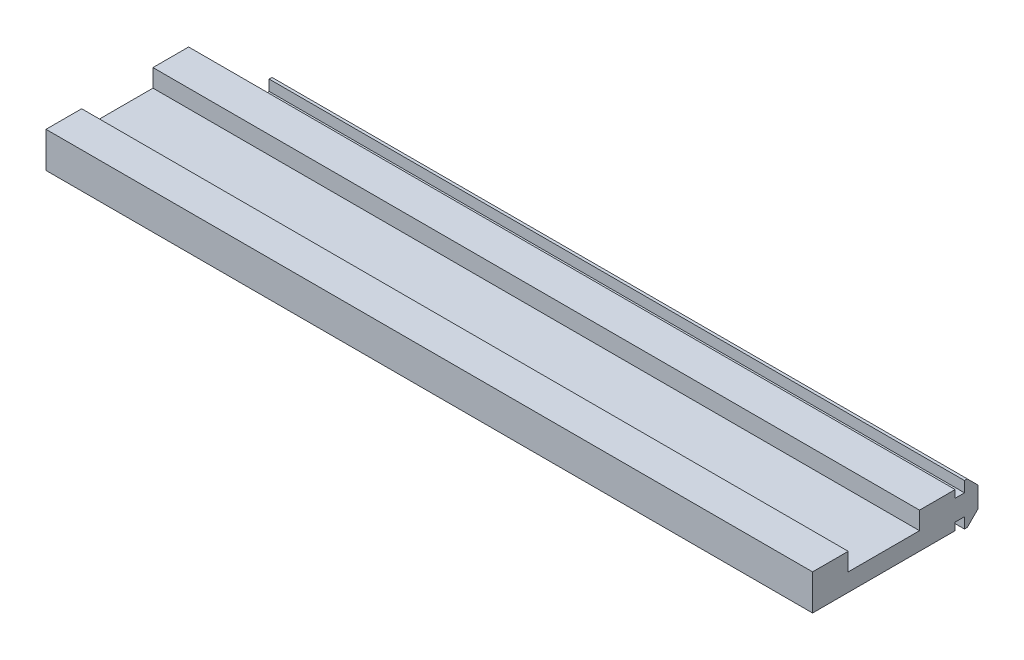
ISO-10303-21;
HEADER;
FILE_DESCRIPTION(('STEP AP214'),'2;1');
FILE_NAME('part.step','',(''),(''),'','','');
FILE_SCHEMA(('AUTOMOTIVE_DESIGN { 1 0 10303 214 1 1 1 1 }'));
ENDSEC;
DATA;
#1=APPLICATION_CONTEXT('core data for automotive mechanical design processes');
#2=APPLICATION_PROTOCOL_DEFINITION('international standard','automotive_design',2000,#1);
#3=PRODUCT_CONTEXT('',#1,'mechanical');
#4=PRODUCT('Part','Part','',(#3));
#5=PRODUCT_RELATED_PRODUCT_CATEGORY('part','',(#4));
#6=PRODUCT_DEFINITION_FORMATION('','',#4);
#7=PRODUCT_DEFINITION_CONTEXT('part definition',#1,'design');
#8=PRODUCT_DEFINITION('design','',#6,#7);
#9=PRODUCT_DEFINITION_SHAPE('','',#8);
#10=(LENGTH_UNIT() NAMED_UNIT(*) SI_UNIT(.MILLI.,.METRE.));
#11=(NAMED_UNIT(*) PLANE_ANGLE_UNIT() SI_UNIT($,.RADIAN.));
#12=(NAMED_UNIT(*) SI_UNIT($,.STERADIAN.) SOLID_ANGLE_UNIT());
#13=UNCERTAINTY_MEASURE_WITH_UNIT(LENGTH_MEASURE(1.E-05),#10,'distance_accuracy_value','');
#14=(GEOMETRIC_REPRESENTATION_CONTEXT(3) GLOBAL_UNCERTAINTY_ASSIGNED_CONTEXT((#13)) GLOBAL_UNIT_ASSIGNED_CONTEXT((#10,
#11,#12)) REPRESENTATION_CONTEXT('',''));
#15=CARTESIAN_POINT('',(0.,0.,0.));
#16=DIRECTION('',(0.,0.,1.));
#17=DIRECTION('',(1.,0.,0.));
#18=AXIS2_PLACEMENT_3D('',#15,#16,#17);
#19=CARTESIAN_POINT('',(495.,5.,0.));
#20=DIRECTION('',(0.,1.,0.));
#21=DIRECTION('',(0.,0.,1.));
#22=AXIS2_PLACEMENT_3D('',#19,#20,#21);
#23=PLANE('',#22);
#24=DIRECTION('',(-1.,0.,0.));
#25=VECTOR('',#24,1.);
#26=CARTESIAN_POINT('',(495.,5.,20.5));
#27=LINE('',#26,#25);
#28=CARTESIAN_POINT('',(280.,5.,20.5));
#29=VERTEX_POINT('',#28);
#30=CARTESIAN_POINT('',(65.,5.,20.5));
#31=VERTEX_POINT('',#30);
#32=EDGE_CURVE('E50',#29,#31,#27,.T.);
#33=ORIENTED_EDGE('',*,*,#32,.F.);
#34=DIRECTION('',(0.,0.,-1.));
#35=VECTOR('',#34,1.);
#36=CARTESIAN_POINT('',(280.,5.,0.));
#37=LINE('',#36,#35);
#38=CARTESIAN_POINT('',(280.,5.,10.5));
#39=VERTEX_POINT('',#38);
#40=EDGE_CURVE('E247',#29,#39,#37,.T.);
#41=ORIENTED_EDGE('',*,*,#40,.T.);
#42=DIRECTION('',(-1.,0.,0.));
#43=VECTOR('',#42,1.);
#44=CARTESIAN_POINT('',(495.,5.,10.5));
#45=LINE('',#44,#43);
#46=CARTESIAN_POINT('',(65.,5.,10.5));
#47=VERTEX_POINT('',#46);
#48=EDGE_CURVE('E11',#39,#47,#45,.T.);
#49=ORIENTED_EDGE('',*,*,#48,.T.);
#50=DIRECTION('',(0.,0.,-1.));
#51=VECTOR('',#50,1.);
#52=CARTESIAN_POINT('',(65.,5.,0.));
#53=LINE('',#52,#51);
#54=EDGE_CURVE('E251',#31,#47,#53,.T.);
#55=ORIENTED_EDGE('',*,*,#54,.F.);
#56=EDGE_LOOP('',(#33,#41,#49,#55));
#57=FACE_BOUND('',#56,.T.);
#58=ADVANCED_FACE('F43',(#57),#23,.T.);
#59=CARTESIAN_POINT('',(495.,0.,20.5));
#60=DIRECTION('',(0.,0.,1.));
#61=DIRECTION('',(1.,0.,0.));
#62=AXIS2_PLACEMENT_3D('',#59,#60,#61);
#63=PLANE('',#62);
#64=DIRECTION('',(-1.,0.,0.));
#65=VECTOR('',#64,1.);
#66=CARTESIAN_POINT('',(495.,0.,20.5));
#67=LINE('',#66,#65);
#68=CARTESIAN_POINT('',(280.,0.,20.5));
#69=VERTEX_POINT('',#68);
#70=CARTESIAN_POINT('',(65.,0.,20.5));
#71=VERTEX_POINT('',#70);
#72=EDGE_CURVE('E285',#69,#71,#67,.T.);
#73=ORIENTED_EDGE('',*,*,#72,.F.);
#74=DIRECTION('',(0.,1.,0.));
#75=VECTOR('',#74,1.);
#76=CARTESIAN_POINT('',(280.,0.,20.5));
#77=LINE('',#76,#75);
#78=EDGE_CURVE('E244',#69,#29,#77,.T.);
#79=ORIENTED_EDGE('',*,*,#78,.T.);
#80=ORIENTED_EDGE('',*,*,#32,.T.);
#81=DIRECTION('',(0.,1.,0.));
#82=VECTOR('',#81,1.);
#83=CARTESIAN_POINT('',(65.,0.,20.5));
#84=LINE('',#83,#82);
#85=EDGE_CURVE('E254',#71,#31,#84,.T.);
#86=ORIENTED_EDGE('',*,*,#85,.F.);
#87=EDGE_LOOP('',(#73,#79,#80,#86));
#88=FACE_BOUND('',#87,.T.);
#89=ADVANCED_FACE('F291',(#88),#63,.T.);
#90=CARTESIAN_POINT('',(495.,0.,0.));
#91=DIRECTION('',(0.,1.,0.));
#92=DIRECTION('',(0.,0.,1.));
#93=AXIS2_PLACEMENT_3D('',#90,#91,#92);
#94=PLANE('',#93);
#95=DIRECTION('',(-1.,0.,0.));
#96=VECTOR('',#95,1.);
#97=CARTESIAN_POINT('',(495.,0.,40.5));
#98=LINE('',#97,#96);
#99=CARTESIAN_POINT('',(280.,0.,40.5));
#100=VERTEX_POINT('',#99);
#101=CARTESIAN_POINT('',(65.,0.,40.5));
#102=VERTEX_POINT('',#101);
#103=EDGE_CURVE('E283',#100,#102,#98,.T.);
#104=ORIENTED_EDGE('',*,*,#103,.F.);
#105=DIRECTION('',(0.,0.,-1.));
#106=VECTOR('',#105,1.);
#107=CARTESIAN_POINT('',(280.,0.,0.));
#108=LINE('',#107,#106);
#109=EDGE_CURVE('E241',#100,#69,#108,.T.);
#110=ORIENTED_EDGE('',*,*,#109,.T.);
#111=ORIENTED_EDGE('',*,*,#72,.T.);
#112=DIRECTION('',(0.,0.,-1.));
#113=VECTOR('',#112,1.);
#114=CARTESIAN_POINT('',(65.,0.,0.));
#115=LINE('',#114,#113);
#116=EDGE_CURVE('E257',#102,#71,#115,.T.);
#117=ORIENTED_EDGE('',*,*,#116,.F.);
#118=EDGE_LOOP('',(#104,#110,#111,#117));
#119=FACE_BOUND('',#118,.T.);
#120=ADVANCED_FACE('F301',(#119),#94,.T.);
#121=CARTESIAN_POINT('',(495.,0.,40.5));
#122=DIRECTION('',(0.,0.,-1.));
#123=DIRECTION('',(-1.,0.,0.));
#124=AXIS2_PLACEMENT_3D('',#121,#122,#123);
#125=PLANE('',#124);
#126=DIRECTION('',(-1.,0.,0.));
#127=VECTOR('',#126,1.);
#128=CARTESIAN_POINT('',(495.,4.99999999999999,40.5));
#129=LINE('',#128,#127);
#130=CARTESIAN_POINT('',(280.,4.99999999999999,40.5));
#131=VERTEX_POINT('',#130);
#132=CARTESIAN_POINT('',(65.,4.99999999999999,40.5));
#133=VERTEX_POINT('',#132);
#134=EDGE_CURVE('E281',#131,#133,#129,.T.);
#135=ORIENTED_EDGE('',*,*,#134,.F.);
#136=DIRECTION('',(0.,-1.,0.));
#137=VECTOR('',#136,1.);
#138=CARTESIAN_POINT('',(280.,0.,40.5));
#139=LINE('',#138,#137);
#140=EDGE_CURVE('E238',#131,#100,#139,.T.);
#141=ORIENTED_EDGE('',*,*,#140,.T.);
#142=ORIENTED_EDGE('',*,*,#103,.T.);
#143=DIRECTION('',(0.,-1.,0.));
#144=VECTOR('',#143,1.);
#145=CARTESIAN_POINT('',(65.,0.,40.5));
#146=LINE('',#145,#144);
#147=EDGE_CURVE('E260',#133,#102,#146,.T.);
#148=ORIENTED_EDGE('',*,*,#147,.F.);
#149=EDGE_LOOP('',(#135,#141,#142,#148));
#150=FACE_BOUND('',#149,.T.);
#151=ADVANCED_FACE('F304',(#150),#125,.T.);
#152=CARTESIAN_POINT('',(495.,4.99999999999999,0.));
#153=DIRECTION('',(0.,1.,0.));
#154=DIRECTION('',(0.,0.,1.));
#155=AXIS2_PLACEMENT_3D('',#152,#153,#154);
#156=PLANE('',#155);
#157=DIRECTION('',(-1.,0.,0.));
#158=VECTOR('',#157,1.);
#159=CARTESIAN_POINT('',(495.,4.99999999999999,50.5));
#160=LINE('',#159,#158);
#161=CARTESIAN_POINT('',(280.,4.99999999999999,50.5));
#162=VERTEX_POINT('',#161);
#163=CARTESIAN_POINT('',(65.,4.99999999999999,50.5));
#164=VERTEX_POINT('',#163);
#165=EDGE_CURVE('E279',#162,#164,#160,.T.);
#166=ORIENTED_EDGE('',*,*,#165,.F.);
#167=DIRECTION('',(0.,0.,-1.));
#168=VECTOR('',#167,1.);
#169=CARTESIAN_POINT('',(280.,4.99999999999999,0.));
#170=LINE('',#169,#168);
#171=EDGE_CURVE('E235',#162,#131,#170,.T.);
#172=ORIENTED_EDGE('',*,*,#171,.T.);
#173=ORIENTED_EDGE('',*,*,#134,.T.);
#174=DIRECTION('',(0.,0.,-1.));
#175=VECTOR('',#174,1.);
#176=CARTESIAN_POINT('',(65.,4.99999999999999,0.));
#177=LINE('',#176,#175);
#178=EDGE_CURVE('E263',#164,#133,#177,.T.);
#179=ORIENTED_EDGE('',*,*,#178,.F.);
#180=EDGE_LOOP('',(#166,#172,#173,#179));
#181=FACE_BOUND('',#180,.T.);
#182=ADVANCED_FACE('F308',(#181),#156,.T.);
#183=CARTESIAN_POINT('',(495.,0.,50.5));
#184=DIRECTION('',(0.,0.,1.));
#185=DIRECTION('',(1.,0.,0.));
#186=AXIS2_PLACEMENT_3D('',#183,#184,#185);
#187=PLANE('',#186);
#188=DIRECTION('',(-1.,0.,0.));
#189=VECTOR('',#188,1.);
#190=CARTESIAN_POINT('',(495.,-5.00000000000001,50.5));
#191=LINE('',#190,#189);
#192=CARTESIAN_POINT('',(280.,-5.00000000000001,50.5));
#193=VERTEX_POINT('',#192);
#194=CARTESIAN_POINT('',(65.,-5.00000000000001,50.5));
#195=VERTEX_POINT('',#194);
#196=EDGE_CURVE('E277',#193,#195,#191,.T.);
#197=ORIENTED_EDGE('',*,*,#196,.F.);
#198=DIRECTION('',(0.,1.,0.));
#199=VECTOR('',#198,1.);
#200=CARTESIAN_POINT('',(280.,0.,50.5));
#201=LINE('',#200,#199);
#202=EDGE_CURVE('E232',#193,#162,#201,.T.);
#203=ORIENTED_EDGE('',*,*,#202,.T.);
#204=ORIENTED_EDGE('',*,*,#165,.T.);
#205=DIRECTION('',(0.,1.,0.));
#206=VECTOR('',#205,1.);
#207=CARTESIAN_POINT('',(65.,0.,50.5));
#208=LINE('',#207,#206);
#209=EDGE_CURVE('E266',#195,#164,#208,.T.);
#210=ORIENTED_EDGE('',*,*,#209,.F.);
#211=EDGE_LOOP('',(#197,#203,#204,#210));
#212=FACE_BOUND('',#211,.T.);
#213=ADVANCED_FACE('F311',(#212),#187,.T.);
#214=CARTESIAN_POINT('',(495.,-5.,0.));
#215=DIRECTION('',(0.,-1.,0.));
#216=DIRECTION('',(0.,0.,-1.));
#217=AXIS2_PLACEMENT_3D('',#214,#215,#216);
#218=PLANE('',#217);
#219=DIRECTION('',(-1.,0.,0.));
#220=VECTOR('',#219,1.);
#221=CARTESIAN_POINT('',(495.,-5.,10.5));
#222=LINE('',#221,#220);
#223=CARTESIAN_POINT('',(280.,-5.,10.5));
#224=VERTEX_POINT('',#223);
#225=CARTESIAN_POINT('',(65.,-5.,10.5));
#226=VERTEX_POINT('',#225);
#227=EDGE_CURVE('E275',#224,#226,#222,.T.);
#228=ORIENTED_EDGE('',*,*,#227,.F.);
#229=DIRECTION('',(0.,0.,1.));
#230=VECTOR('',#229,1.);
#231=CARTESIAN_POINT('',(280.,-5.,0.));
#232=LINE('',#231,#230);
#233=EDGE_CURVE('E229',#224,#193,#232,.T.);
#234=ORIENTED_EDGE('',*,*,#233,.T.);
#235=ORIENTED_EDGE('',*,*,#196,.T.);
#236=DIRECTION('',(0.,0.,1.));
#237=VECTOR('',#236,1.);
#238=CARTESIAN_POINT('',(65.,-5.,0.));
#239=LINE('',#238,#237);
#240=EDGE_CURVE('E269',#226,#195,#239,.T.);
#241=ORIENTED_EDGE('',*,*,#240,.F.);
#242=EDGE_LOOP('',(#228,#234,#235,#241));
#243=FACE_BOUND('',#242,.T.);
#244=ADVANCED_FACE('F316',(#243),#218,.T.);
#245=CARTESIAN_POINT('',(495.,0.,10.5));
#246=DIRECTION('',(0.,0.,-1.));
#247=DIRECTION('',(-1.,0.,0.));
#248=AXIS2_PLACEMENT_3D('',#245,#246,#247);
#249=PLANE('',#248);
#250=DIRECTION('',(1.,0.,0.));
#251=VECTOR('',#250,1.);
#252=CARTESIAN_POINT('',(495.,2.9,10.5));
#253=LINE('',#252,#251);
#254=CARTESIAN_POINT('',(85.,2.9,10.5));
#255=VERTEX_POINT('',#254);
#256=CARTESIAN_POINT('',(280.,2.9,10.5));
#257=VERTEX_POINT('',#256);
#258=EDGE_CURVE('E221',#255,#257,#253,.T.);
#259=ORIENTED_EDGE('',*,*,#258,.F.);
#260=DIRECTION('',(0.,1.,0.));
#261=VECTOR('',#260,1.);
#262=CARTESIAN_POINT('',(85.,8.21817545437253,10.5));
#263=LINE('',#262,#261);
#264=CARTESIAN_POINT('',(85.,-2.9,10.5));
#265=VERTEX_POINT('',#264);
#266=EDGE_CURVE('E57',#265,#255,#263,.T.);
#267=ORIENTED_EDGE('',*,*,#266,.F.);
#268=DIRECTION('',(-1.,0.,0.));
#269=VECTOR('',#268,1.);
#270=CARTESIAN_POINT('',(495.,-2.9,10.5));
#271=LINE('',#270,#269);
#272=CARTESIAN_POINT('',(280.,-2.9,10.5));
#273=VERTEX_POINT('',#272);
#274=EDGE_CURVE('E224',#273,#265,#271,.T.);
#275=ORIENTED_EDGE('',*,*,#274,.F.);
#276=DIRECTION('',(0.,-1.,0.));
#277=VECTOR('',#276,1.);
#278=CARTESIAN_POINT('',(280.,0.,10.5));
#279=LINE('',#278,#277);
#280=EDGE_CURVE('E172',#273,#224,#279,.T.);
#281=ORIENTED_EDGE('',*,*,#280,.T.);
#282=ORIENTED_EDGE('',*,*,#227,.T.);
#283=DIRECTION('',(0.,-1.,0.));
#284=VECTOR('',#283,1.);
#285=CARTESIAN_POINT('',(65.,0.,10.5));
#286=LINE('',#285,#284);
#287=EDGE_CURVE('E272',#47,#226,#286,.T.);
#288=ORIENTED_EDGE('',*,*,#287,.F.);
#289=ORIENTED_EDGE('',*,*,#48,.F.);
#290=EDGE_CURVE('E228',#39,#257,#279,.T.);
#291=ORIENTED_EDGE('',*,*,#290,.T.);
#292=EDGE_LOOP('',(#259,#267,#275,#281,#282,#288,#289,#291));
#293=FACE_BOUND('',#292,.T.);
#294=ADVANCED_FACE('F317',(#293),#249,.T.);
#295=CARTESIAN_POINT('',(65.,0.,0.));
#296=DIRECTION('',(1.,0.,0.));
#297=DIRECTION('',(0.,0.,-1.));
#298=AXIS2_PLACEMENT_3D('',#295,#296,#297);
#299=PLANE('',#298);
#300=ORIENTED_EDGE('',*,*,#54,.T.);
#301=ORIENTED_EDGE('',*,*,#287,.T.);
#302=ORIENTED_EDGE('',*,*,#240,.T.);
#303=ORIENTED_EDGE('',*,*,#209,.T.);
#304=ORIENTED_EDGE('',*,*,#178,.T.);
#305=ORIENTED_EDGE('',*,*,#147,.T.);
#306=ORIENTED_EDGE('',*,*,#116,.T.);
#307=ORIENTED_EDGE('',*,*,#85,.T.);
#308=EDGE_LOOP('',(#300,#301,#302,#303,#304,#305,#306,#307));
#309=FACE_BOUND('',#308,.T.);
#310=ADVANCED_FACE('F296',(#309),#299,.F.);
#311=CARTESIAN_POINT('',(85.,0.,0.));
#312=DIRECTION('',(1.,0.,0.));
#313=DIRECTION('',(0.,0.,-1.));
#314=AXIS2_PLACEMENT_3D('',#311,#312,#313);
#315=PLANE('',#314);
#316=ORIENTED_EDGE('',*,*,#266,.T.);
#317=DIRECTION('',(0.,0.,-1.));
#318=VECTOR('',#317,1.);
#319=CARTESIAN_POINT('',(85.,2.9,7.9));
#320=LINE('',#319,#318);
#321=CARTESIAN_POINT('',(85.,2.9,7.9));
#322=VERTEX_POINT('',#321);
#323=EDGE_CURVE('E225',#255,#322,#320,.T.);
#324=ORIENTED_EDGE('',*,*,#323,.T.);
#325=DIRECTION('',(0.,1.,0.));
#326=VECTOR('',#325,1.);
#327=CARTESIAN_POINT('',(85.,5.9,7.9));
#328=LINE('',#327,#326);
#329=CARTESIAN_POINT('',(85.,5.9,7.9));
#330=VERTEX_POINT('',#329);
#331=EDGE_CURVE('E333',#322,#330,#328,.T.);
#332=ORIENTED_EDGE('',*,*,#331,.T.);
#333=DIRECTION('',(0.,0.,-1.));
#334=VECTOR('',#333,1.);
#335=CARTESIAN_POINT('',(85.,5.9,7.10208152801713));
#336=LINE('',#335,#334);
#337=CARTESIAN_POINT('',(85.,5.9,7.10208152801713));
#338=VERTEX_POINT('',#337);
#339=EDGE_CURVE('E331',#330,#338,#336,.T.);
#340=ORIENTED_EDGE('',*,*,#339,.T.);
#341=DIRECTION('',(0.,-0.707106781186548,-0.707106781186548));
#342=VECTOR('',#341,1.);
#343=CARTESIAN_POINT('',(85.,2.89791847198287,4.1));
#344=LINE('',#343,#342);
#345=CARTESIAN_POINT('',(85.,2.89791847198287,4.1));
#346=VERTEX_POINT('',#345);
#347=EDGE_CURVE('E329',#338,#346,#344,.T.);
#348=ORIENTED_EDGE('',*,*,#347,.T.);
#349=DIRECTION('',(0.,-1.,0.));
#350=VECTOR('',#349,1.);
#351=CARTESIAN_POINT('',(85.,-2.89791847198287,4.1));
#352=LINE('',#351,#350);
#353=CARTESIAN_POINT('',(85.,-2.89791847198287,4.1));
#354=VERTEX_POINT('',#353);
#355=EDGE_CURVE('E327',#346,#354,#352,.T.);
#356=ORIENTED_EDGE('',*,*,#355,.T.);
#357=DIRECTION('',(0.,-0.707106781186548,0.707106781186548));
#358=VECTOR('',#357,1.);
#359=CARTESIAN_POINT('',(85.,-5.9,7.10208152801713));
#360=LINE('',#359,#358);
#361=CARTESIAN_POINT('',(85.,-5.9,7.10208152801713));
#362=VERTEX_POINT('',#361);
#363=EDGE_CURVE('E325',#354,#362,#360,.T.);
#364=ORIENTED_EDGE('',*,*,#363,.T.);
#365=DIRECTION('',(0.,0.,1.));
#366=VECTOR('',#365,1.);
#367=CARTESIAN_POINT('',(85.,-5.9,7.89999999999999));
#368=LINE('',#367,#366);
#369=CARTESIAN_POINT('',(85.,-5.9,7.89999999999999));
#370=VERTEX_POINT('',#369);
#371=EDGE_CURVE('E321',#362,#370,#368,.T.);
#372=ORIENTED_EDGE('',*,*,#371,.T.);
#373=DIRECTION('',(0.,1.,0.));
#374=VECTOR('',#373,1.);
#375=CARTESIAN_POINT('',(85.,-2.9,7.89999999999999));
#376=LINE('',#375,#374);
#377=CARTESIAN_POINT('',(85.,-2.9,7.89999999999999));
#378=VERTEX_POINT('',#377);
#379=EDGE_CURVE('E319',#370,#378,#376,.T.);
#380=ORIENTED_EDGE('',*,*,#379,.T.);
#381=DIRECTION('',(0.,0.,1.));
#382=VECTOR('',#381,1.);
#383=CARTESIAN_POINT('',(85.,-2.9,10.7));
#384=LINE('',#383,#382);
#385=EDGE_CURVE('E180',#378,#265,#384,.T.);
#386=ORIENTED_EDGE('',*,*,#385,.T.);
#387=EDGE_LOOP('',(#316,#324,#332,#340,#348,#356,#364,#372,#380,#386));
#388=FACE_BOUND('',#387,.T.);
#389=ADVANCED_FACE('F318',(#388),#315,.F.);
#390=CARTESIAN_POINT('',(280.,0.,0.));
#391=DIRECTION('',(1.,0.,0.));
#392=DIRECTION('',(0.,0.,-1.));
#393=AXIS2_PLACEMENT_3D('',#390,#391,#392);
#394=PLANE('',#393);
#395=ORIENTED_EDGE('',*,*,#280,.F.);
#396=DIRECTION('',(0.,0.,-1.));
#397=VECTOR('',#396,1.);
#398=CARTESIAN_POINT('',(280.,-2.9,10.7));
#399=LINE('',#398,#397);
#400=CARTESIAN_POINT('',(280.,-2.9,7.89999999999999));
#401=VERTEX_POINT('',#400);
#402=EDGE_CURVE('E165',#273,#401,#399,.T.);
#403=ORIENTED_EDGE('',*,*,#402,.T.);
#404=DIRECTION('',(0.,-1.,0.));
#405=VECTOR('',#404,1.);
#406=CARTESIAN_POINT('',(280.,-2.9,7.89999999999999));
#407=LINE('',#406,#405);
#408=CARTESIAN_POINT('',(280.,-5.9,7.89999999999999));
#409=VERTEX_POINT('',#408);
#410=EDGE_CURVE('E170',#401,#409,#407,.T.);
#411=ORIENTED_EDGE('',*,*,#410,.T.);
#412=DIRECTION('',(0.,0.,-1.));
#413=VECTOR('',#412,1.);
#414=CARTESIAN_POINT('',(280.,-5.9,7.89999999999999));
#415=LINE('',#414,#413);
#416=CARTESIAN_POINT('',(280.,-5.9,7.10208152801713));
#417=VERTEX_POINT('',#416);
#418=EDGE_CURVE('E189',#409,#417,#415,.T.);
#419=ORIENTED_EDGE('',*,*,#418,.T.);
#420=DIRECTION('',(0.,0.707106781186548,-0.707106781186548));
#421=VECTOR('',#420,1.);
#422=CARTESIAN_POINT('',(280.,-5.9,7.10208152801713));
#423=LINE('',#422,#421);
#424=CARTESIAN_POINT('',(280.,-2.89791847198287,4.1));
#425=VERTEX_POINT('',#424);
#426=EDGE_CURVE('E191',#417,#425,#423,.T.);
#427=ORIENTED_EDGE('',*,*,#426,.T.);
#428=DIRECTION('',(0.,1.,0.));
#429=VECTOR('',#428,1.);
#430=CARTESIAN_POINT('',(280.,-2.89791847198287,4.1));
#431=LINE('',#430,#429);
#432=CARTESIAN_POINT('',(280.,2.89791847198287,4.1));
#433=VERTEX_POINT('',#432);
#434=EDGE_CURVE('E197',#425,#433,#431,.T.);
#435=ORIENTED_EDGE('',*,*,#434,.T.);
#436=DIRECTION('',(0.,0.707106781186548,0.707106781186548));
#437=VECTOR('',#436,1.);
#438=CARTESIAN_POINT('',(280.,2.89791847198287,4.1));
#439=LINE('',#438,#437);
#440=CARTESIAN_POINT('',(280.,5.9,7.10208152801713));
#441=VERTEX_POINT('',#440);
#442=EDGE_CURVE('E200',#433,#441,#439,.T.);
#443=ORIENTED_EDGE('',*,*,#442,.T.);
#444=DIRECTION('',(0.,0.,1.));
#445=VECTOR('',#444,1.);
#446=CARTESIAN_POINT('',(280.,5.9,7.10208152801713));
#447=LINE('',#446,#445);
#448=CARTESIAN_POINT('',(280.,5.9,7.9));
#449=VERTEX_POINT('',#448);
#450=EDGE_CURVE('E203',#441,#449,#447,.T.);
#451=ORIENTED_EDGE('',*,*,#450,.T.);
#452=DIRECTION('',(0.,-1.,0.));
#453=VECTOR('',#452,1.);
#454=CARTESIAN_POINT('',(280.,5.9,7.9));
#455=LINE('',#454,#453);
#456=CARTESIAN_POINT('',(280.,2.9,7.9));
#457=VERTEX_POINT('',#456);
#458=EDGE_CURVE('E184',#449,#457,#455,.T.);
#459=ORIENTED_EDGE('',*,*,#458,.T.);
#460=DIRECTION('',(0.,0.,1.));
#461=VECTOR('',#460,1.);
#462=CARTESIAN_POINT('',(280.,2.9,7.9));
#463=LINE('',#462,#461);
#464=EDGE_CURVE('E174',#457,#257,#463,.T.);
#465=ORIENTED_EDGE('',*,*,#464,.T.);
#466=ORIENTED_EDGE('',*,*,#290,.F.);
#467=ORIENTED_EDGE('',*,*,#40,.F.);
#468=ORIENTED_EDGE('',*,*,#78,.F.);
#469=ORIENTED_EDGE('',*,*,#109,.F.);
#470=ORIENTED_EDGE('',*,*,#140,.F.);
#471=ORIENTED_EDGE('',*,*,#171,.F.);
#472=ORIENTED_EDGE('',*,*,#202,.F.);
#473=ORIENTED_EDGE('',*,*,#233,.F.);
#474=EDGE_LOOP('',(#395,#403,#411,#419,#427,#435,#443,#451,#459,#465,#466,#467,#468,#469,#470,
#471,#472,#473));
#475=FACE_BOUND('',#474,.T.);
#476=ADVANCED_FACE('F167',(#475),#394,.T.);
#477=CARTESIAN_POINT('',(71.4796449750756,-2.9,10.7));
#478=DIRECTION('',(0.,-1.,0.));
#479=DIRECTION('',(0.,0.,-1.));
#480=AXIS2_PLACEMENT_3D('',#477,#478,#479);
#481=PLANE('',#480);
#482=ORIENTED_EDGE('',*,*,#402,.F.);
#483=ORIENTED_EDGE('',*,*,#274,.T.);
#484=ORIENTED_EDGE('',*,*,#385,.F.);
#485=DIRECTION('',(1.,0.,0.));
#486=VECTOR('',#485,1.);
#487=CARTESIAN_POINT('',(71.4796449750756,-2.9,7.89999999999999));
#488=LINE('',#487,#486);
#489=EDGE_CURVE('E178',#378,#401,#488,.T.);
#490=ORIENTED_EDGE('',*,*,#489,.T.);
#491=EDGE_LOOP('',(#482,#483,#484,#490));
#492=FACE_BOUND('',#491,.T.);
#493=ADVANCED_FACE('F179',(#492),#481,.T.);
#494=CARTESIAN_POINT('',(71.4796449750756,-2.9,7.89999999999999));
#495=DIRECTION('',(0.,0.,1.));
#496=DIRECTION('',(1.,0.,0.));
#497=AXIS2_PLACEMENT_3D('',#494,#495,#496);
#498=PLANE('',#497);
#499=ORIENTED_EDGE('',*,*,#379,.F.);
#500=DIRECTION('',(1.,0.,0.));
#501=VECTOR('',#500,1.);
#502=CARTESIAN_POINT('',(71.4796449750756,-5.9,7.89999999999999));
#503=LINE('',#502,#501);
#504=EDGE_CURVE('E183',#370,#409,#503,.T.);
#505=ORIENTED_EDGE('',*,*,#504,.T.);
#506=ORIENTED_EDGE('',*,*,#410,.F.);
#507=ORIENTED_EDGE('',*,*,#489,.F.);
#508=EDGE_LOOP('',(#499,#505,#506,#507));
#509=FACE_BOUND('',#508,.T.);
#510=ADVANCED_FACE('F186',(#509),#498,.T.);
#511=CARTESIAN_POINT('',(71.4796449750756,-5.9,7.89999999999999));
#512=DIRECTION('',(0.,-1.,0.));
#513=DIRECTION('',(0.,0.,-1.));
#514=AXIS2_PLACEMENT_3D('',#511,#512,#513);
#515=PLANE('',#514);
#516=ORIENTED_EDGE('',*,*,#371,.F.);
#517=DIRECTION('',(1.,0.,0.));
#518=VECTOR('',#517,1.);
#519=CARTESIAN_POINT('',(71.4796449750756,-5.9,7.10208152801713));
#520=LINE('',#519,#518);
#521=EDGE_CURVE('E218',#362,#417,#520,.T.);
#522=ORIENTED_EDGE('',*,*,#521,.T.);
#523=ORIENTED_EDGE('',*,*,#418,.F.);
#524=ORIENTED_EDGE('',*,*,#504,.F.);
#525=EDGE_LOOP('',(#516,#522,#523,#524));
#526=FACE_BOUND('',#525,.T.);
#527=ADVANCED_FACE('F368',(#526),#515,.T.);
#528=CARTESIAN_POINT('',(71.4796449750756,-5.9,7.10208152801713));
#529=DIRECTION('',(0.,-0.707106781186547,-0.707106781186547));
#530=DIRECTION('',(0.,0.707106781186548,-0.707106781186548));
#531=AXIS2_PLACEMENT_3D('',#528,#529,#530);
#532=PLANE('',#531);
#533=ORIENTED_EDGE('',*,*,#363,.F.);
#534=DIRECTION('',(1.,0.,0.));
#535=VECTOR('',#534,1.);
#536=CARTESIAN_POINT('',(71.4796449750756,-2.89791847198287,4.1));
#537=LINE('',#536,#535);
#538=EDGE_CURVE('E216',#354,#425,#537,.T.);
#539=ORIENTED_EDGE('',*,*,#538,.T.);
#540=ORIENTED_EDGE('',*,*,#426,.F.);
#541=ORIENTED_EDGE('',*,*,#521,.F.);
#542=EDGE_LOOP('',(#533,#539,#540,#541));
#543=FACE_BOUND('',#542,.T.);
#544=ADVANCED_FACE('F364',(#543),#532,.T.);
#545=CARTESIAN_POINT('',(71.4796449750756,-2.89791847198287,4.1));
#546=DIRECTION('',(0.,0.,-1.));
#547=DIRECTION('',(-1.,0.,0.));
#548=AXIS2_PLACEMENT_3D('',#545,#546,#547);
#549=PLANE('',#548);
#550=ORIENTED_EDGE('',*,*,#355,.F.);
#551=DIRECTION('',(1.,0.,0.));
#552=VECTOR('',#551,1.);
#553=CARTESIAN_POINT('',(71.4796449750756,2.89791847198287,4.1));
#554=LINE('',#553,#552);
#555=EDGE_CURVE('E214',#346,#433,#554,.T.);
#556=ORIENTED_EDGE('',*,*,#555,.T.);
#557=ORIENTED_EDGE('',*,*,#434,.F.);
#558=ORIENTED_EDGE('',*,*,#538,.F.);
#559=EDGE_LOOP('',(#550,#556,#557,#558));
#560=FACE_BOUND('',#559,.T.);
#561=ADVANCED_FACE('F361',(#560),#549,.T.);
#562=CARTESIAN_POINT('',(71.4796449750756,2.89791847198287,4.1));
#563=DIRECTION('',(0.,0.707106781186548,-0.707106781186548));
#564=DIRECTION('',(0.,0.707106781186548,0.707106781186548));
#565=AXIS2_PLACEMENT_3D('',#562,#563,#564);
#566=PLANE('',#565);
#567=ORIENTED_EDGE('',*,*,#347,.F.);
#568=DIRECTION('',(1.,0.,0.));
#569=VECTOR('',#568,1.);
#570=CARTESIAN_POINT('',(71.4796449750756,5.9,7.10208152801713));
#571=LINE('',#570,#569);
#572=EDGE_CURVE('E212',#338,#441,#571,.T.);
#573=ORIENTED_EDGE('',*,*,#572,.T.);
#574=ORIENTED_EDGE('',*,*,#442,.F.);
#575=ORIENTED_EDGE('',*,*,#555,.F.);
#576=EDGE_LOOP('',(#567,#573,#574,#575));
#577=FACE_BOUND('',#576,.T.);
#578=ADVANCED_FACE('F356',(#577),#566,.T.);
#579=CARTESIAN_POINT('',(71.4796449750756,5.9,7.10208152801713));
#580=DIRECTION('',(0.,1.,0.));
#581=DIRECTION('',(0.,0.,1.));
#582=AXIS2_PLACEMENT_3D('',#579,#580,#581);
#583=PLANE('',#582);
#584=ORIENTED_EDGE('',*,*,#339,.F.);
#585=DIRECTION('',(1.,0.,0.));
#586=VECTOR('',#585,1.);
#587=CARTESIAN_POINT('',(71.4796449750756,5.9,7.9));
#588=LINE('',#587,#586);
#589=EDGE_CURVE('E210',#330,#449,#588,.T.);
#590=ORIENTED_EDGE('',*,*,#589,.T.);
#591=ORIENTED_EDGE('',*,*,#450,.F.);
#592=ORIENTED_EDGE('',*,*,#572,.F.);
#593=EDGE_LOOP('',(#584,#590,#591,#592));
#594=FACE_BOUND('',#593,.T.);
#595=ADVANCED_FACE('F349',(#594),#583,.T.);
#596=CARTESIAN_POINT('',(71.4796449750756,5.9,7.9));
#597=DIRECTION('',(0.,0.,1.));
#598=DIRECTION('',(1.,0.,0.));
#599=AXIS2_PLACEMENT_3D('',#596,#597,#598);
#600=PLANE('',#599);
#601=ORIENTED_EDGE('',*,*,#331,.F.);
#602=DIRECTION('',(1.,0.,0.));
#603=VECTOR('',#602,1.);
#604=CARTESIAN_POINT('',(71.4796449750756,2.9,7.9));
#605=LINE('',#604,#603);
#606=EDGE_CURVE('E208',#322,#457,#605,.T.);
#607=ORIENTED_EDGE('',*,*,#606,.T.);
#608=ORIENTED_EDGE('',*,*,#458,.F.);
#609=ORIENTED_EDGE('',*,*,#589,.F.);
#610=EDGE_LOOP('',(#601,#607,#608,#609));
#611=FACE_BOUND('',#610,.T.);
#612=ADVANCED_FACE('F346',(#611),#600,.T.);
#613=CARTESIAN_POINT('',(71.4796449750756,2.9,7.9));
#614=DIRECTION('',(0.,1.,0.));
#615=DIRECTION('',(0.,0.,1.));
#616=AXIS2_PLACEMENT_3D('',#613,#614,#615);
#617=PLANE('',#616);
#618=ORIENTED_EDGE('',*,*,#323,.F.);
#619=ORIENTED_EDGE('',*,*,#258,.T.);
#620=ORIENTED_EDGE('',*,*,#464,.F.);
#621=ORIENTED_EDGE('',*,*,#606,.F.);
#622=EDGE_LOOP('',(#618,#619,#620,#621));
#623=FACE_BOUND('',#622,.T.);
#624=ADVANCED_FACE('F341',(#623),#617,.T.);
#625=CLOSED_SHELL('',(#58,#89,#120,#151,#182,#213,#244,#294,#310,#389,#476,#493,#510,#527,#544,
#561,#578,#595,#612,#624));
#626=MANIFOLD_SOLID_BREP('B2',#625);
#627=ADVANCED_BREP_SHAPE_REPRESENTATION('',(#18,#626),#14);
#628=SHAPE_DEFINITION_REPRESENTATION(#9,#627);
ENDSEC;
END-ISO-10303-21;
